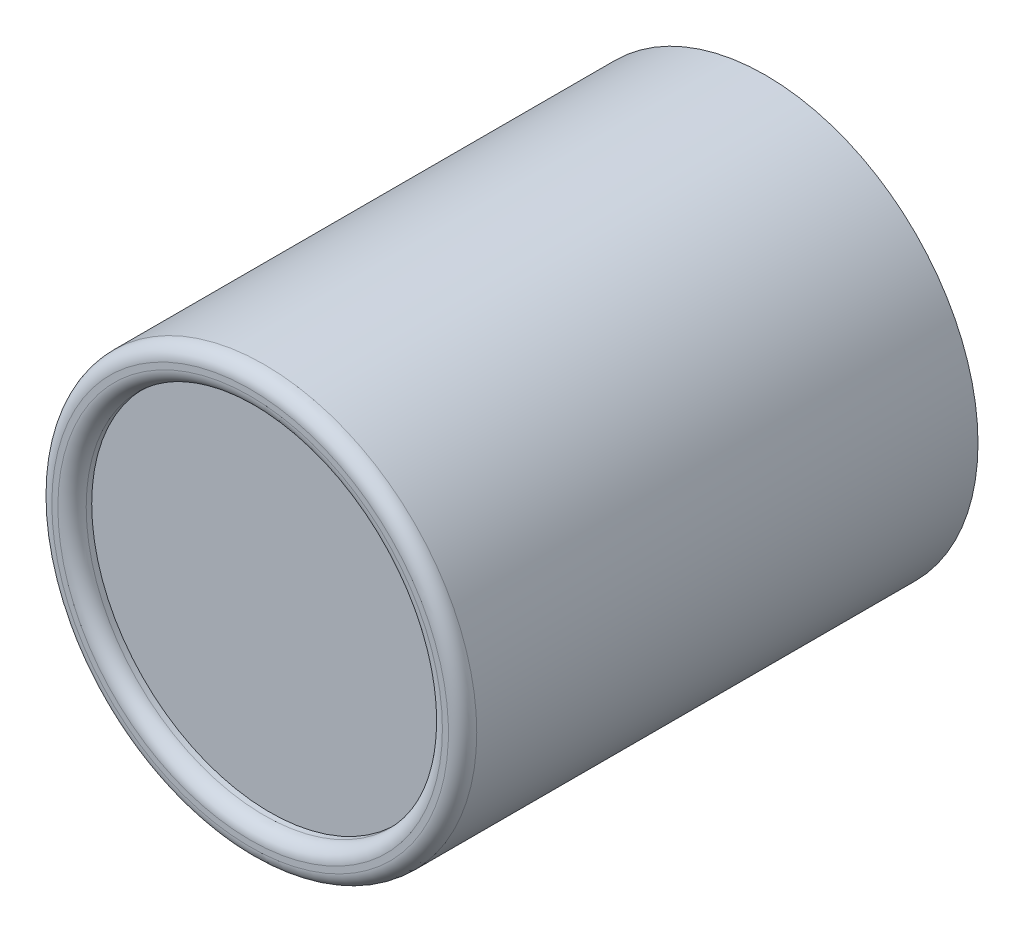
ISO-10303-21;
HEADER;
FILE_DESCRIPTION(('STEP AP214'),'2;1');
FILE_NAME('part.step','',(''),(''),'','','');
FILE_SCHEMA(('AUTOMOTIVE_DESIGN { 1 0 10303 214 1 1 1 1 }'));
ENDSEC;
DATA;
#1=APPLICATION_CONTEXT('core data for automotive mechanical design processes');
#2=APPLICATION_PROTOCOL_DEFINITION('international standard','automotive_design',2000,#1);
#3=PRODUCT_CONTEXT('',#1,'mechanical');
#4=PRODUCT('Part','Part','',(#3));
#5=PRODUCT_RELATED_PRODUCT_CATEGORY('part','',(#4));
#6=PRODUCT_DEFINITION_FORMATION('','',#4);
#7=PRODUCT_DEFINITION_CONTEXT('part definition',#1,'design');
#8=PRODUCT_DEFINITION('design','',#6,#7);
#9=PRODUCT_DEFINITION_SHAPE('','',#8);
#10=(LENGTH_UNIT() NAMED_UNIT(*) SI_UNIT(.MILLI.,.METRE.));
#11=(NAMED_UNIT(*) PLANE_ANGLE_UNIT() SI_UNIT($,.RADIAN.));
#12=(NAMED_UNIT(*) SI_UNIT($,.STERADIAN.) SOLID_ANGLE_UNIT());
#13=UNCERTAINTY_MEASURE_WITH_UNIT(LENGTH_MEASURE(1.E-05),#10,'distance_accuracy_value','');
#14=(GEOMETRIC_REPRESENTATION_CONTEXT(3) GLOBAL_UNCERTAINTY_ASSIGNED_CONTEXT((#13)) GLOBAL_UNIT_ASSIGNED_CONTEXT((#10,
#11,#12)) REPRESENTATION_CONTEXT('',''));
#15=CARTESIAN_POINT('',(0.,0.,0.));
#16=DIRECTION('',(0.,0.,1.));
#17=DIRECTION('',(1.,0.,0.));
#18=AXIS2_PLACEMENT_3D('',#15,#16,#17);
#19=CARTESIAN_POINT('',(0.,0.,0.));
#20=DIRECTION('',(0.,0.,-1.));
#21=DIRECTION('',(-1.,0.,0.));
#22=AXIS2_PLACEMENT_3D('',#19,#20,#21);
#23=CYLINDRICAL_SURFACE('',#22,0.75);
#24=CARTESIAN_POINT('',(0.,0.,0.769458866273396));
#25=DIRECTION('',(0.,0.,-1.));
#26=DIRECTION('',(-1.,0.,0.));
#27=AXIS2_PLACEMENT_3D('',#24,#25,#26);
#28=CIRCLE('',#27,0.75);
#29=CARTESIAN_POINT('',(-0.75,0.,0.769458866273396));
#30=VERTEX_POINT('',#29);
#31=EDGE_CURVE('E10',#30,#30,#28,.T.);
#32=ORIENTED_EDGE('',*,*,#31,.T.);
#33=EDGE_LOOP('',(#32));
#34=FACE_BOUND('',#33,.T.);
#35=CARTESIAN_POINT('',(0.,0.,-1.));
#36=DIRECTION('',(0.,0.,1.));
#37=DIRECTION('',(1.,0.,0.));
#38=AXIS2_PLACEMENT_3D('',#35,#36,#37);
#39=CIRCLE('',#38,0.75);
#40=CARTESIAN_POINT('',(0.75,0.,-1.));
#41=VERTEX_POINT('',#40);
#42=EDGE_CURVE('E56',#41,#41,#39,.T.);
#43=ORIENTED_EDGE('',*,*,#42,.T.);
#44=EDGE_LOOP('',(#43));
#45=FACE_BOUND('',#44,.T.);
#46=ADVANCED_FACE('F34',(#34,#45),#23,.T.);
#47=CARTESIAN_POINT('',(0.,0.,0.769458866273397));
#48=DIRECTION('',(0.,0.,-1.));
#49=DIRECTION('',(-1.,0.,0.));
#50=AXIS2_PLACEMENT_3D('',#47,#48,#49);
#51=TOROIDAL_SURFACE('',#50,0.7,0.05);
#52=CARTESIAN_POINT('',(0.,0.,0.819458866273397));
#53=DIRECTION('',(0.,0.,-1.));
#54=DIRECTION('',(-1.,0.,0.));
#55=AXIS2_PLACEMENT_3D('',#52,#53,#54);
#56=CIRCLE('',#55,0.7);
#57=CARTESIAN_POINT('',(-0.7,0.,0.819458866273397));
#58=VERTEX_POINT('',#57);
#59=EDGE_CURVE('E40',#58,#58,#56,.T.);
#60=ORIENTED_EDGE('',*,*,#59,.T.);
#61=EDGE_LOOP('',(#60));
#62=FACE_BOUND('',#61,.T.);
#63=ORIENTED_EDGE('',*,*,#31,.F.);
#64=EDGE_LOOP('',(#63));
#65=FACE_BOUND('',#64,.T.);
#66=ADVANCED_FACE('F72',(#62,#65),#51,.T.);
#67=CARTESIAN_POINT('',(0.,0.7,0.819458866273397));
#68=DIRECTION('',(0.,0.,1.));
#69=DIRECTION('',(1.,0.,0.));
#70=AXIS2_PLACEMENT_3D('',#67,#68,#69);
#71=PLANE('',#70);
#72=CARTESIAN_POINT('',(0.,0.,0.819458866273397));
#73=DIRECTION('',(0.,0.,-1.));
#74=DIRECTION('',(-1.,0.,0.));
#75=AXIS2_PLACEMENT_3D('',#72,#73,#74);
#76=CIRCLE('',#75,0.678768743353404);
#77=CARTESIAN_POINT('',(-0.678768743353404,0.,0.819458866273397));
#78=VERTEX_POINT('',#77);
#79=EDGE_CURVE('E44',#78,#78,#76,.T.);
#80=ORIENTED_EDGE('',*,*,#79,.T.);
#81=EDGE_LOOP('',(#80));
#82=FACE_BOUND('',#81,.T.);
#83=ORIENTED_EDGE('',*,*,#59,.F.);
#84=EDGE_LOOP('',(#83));
#85=FACE_BOUND('',#84,.T.);
#86=ADVANCED_FACE('F76',(#82,#85),#71,.T.);
#87=CARTESIAN_POINT('',(0.,0.,0.769458866273397));
#88=DIRECTION('',(0.,0.,-1.));
#89=DIRECTION('',(-1.,0.,0.));
#90=AXIS2_PLACEMENT_3D('',#87,#88,#89);
#91=TOROIDAL_SURFACE('',#90,0.678768743353404,0.05);
#92=CARTESIAN_POINT('',(0.,0.,0.769458866273396));
#93=DIRECTION('',(0.,0.,-1.));
#94=DIRECTION('',(-1.,0.,0.));
#95=AXIS2_PLACEMENT_3D('',#92,#93,#94);
#96=CIRCLE('',#95,0.628768743353404);
#97=CARTESIAN_POINT('',(-0.628768743353404,0.,0.769458866273396));
#98=VERTEX_POINT('',#97);
#99=EDGE_CURVE('E48',#98,#98,#96,.T.);
#100=ORIENTED_EDGE('',*,*,#99,.T.);
#101=EDGE_LOOP('',(#100));
#102=FACE_BOUND('',#101,.T.);
#103=ORIENTED_EDGE('',*,*,#79,.F.);
#104=EDGE_LOOP('',(#103));
#105=FACE_BOUND('',#104,.T.);
#106=ADVANCED_FACE('F80',(#102,#105),#91,.T.);
#107=CARTESIAN_POINT('',(0.,0.,0.));
#108=DIRECTION('',(0.,0.,-1.));
#109=DIRECTION('',(-1.,0.,0.));
#110=AXIS2_PLACEMENT_3D('',#107,#108,#109);
#111=CYLINDRICAL_SURFACE('',#110,0.628768743353404);
#112=CARTESIAN_POINT('',(0.,0.,0.75));
#113=DIRECTION('',(0.,0.,-1.));
#114=DIRECTION('',(-1.,0.,0.));
#115=AXIS2_PLACEMENT_3D('',#112,#113,#114);
#116=CIRCLE('',#115,0.628768743353404);
#117=CARTESIAN_POINT('',(-0.628768743353404,0.,0.75));
#118=VERTEX_POINT('',#117);
#119=EDGE_CURVE('E53',#118,#118,#116,.T.);
#120=ORIENTED_EDGE('',*,*,#119,.T.);
#121=EDGE_LOOP('',(#120));
#122=FACE_BOUND('',#121,.T.);
#123=ORIENTED_EDGE('',*,*,#99,.F.);
#124=EDGE_LOOP('',(#123));
#125=FACE_BOUND('',#124,.T.);
#126=ADVANCED_FACE('F68',(#122,#125),#111,.F.);
#127=CARTESIAN_POINT('',(0.,0.628768743353404,0.75));
#128=DIRECTION('',(0.,0.,1.));
#129=DIRECTION('',(1.,0.,0.));
#130=AXIS2_PLACEMENT_3D('',#127,#128,#129);
#131=PLANE('',#130);
#132=ORIENTED_EDGE('',*,*,#119,.F.);
#133=EDGE_LOOP('',(#132));
#134=FACE_BOUND('',#133,.T.);
#135=ADVANCED_FACE('F63',(#134),#131,.T.);
#136=CARTESIAN_POINT('',(0.,0.,-1.));
#137=DIRECTION('',(0.,0.,1.));
#138=DIRECTION('',(1.,0.,0.));
#139=AXIS2_PLACEMENT_3D('',#136,#137,#138);
#140=PLANE('',#139);
#141=ORIENTED_EDGE('',*,*,#42,.F.);
#142=EDGE_LOOP('',(#141));
#143=FACE_BOUND('',#142,.T.);
#144=ADVANCED_FACE('F61',(#143),#140,.F.);
#145=CLOSED_SHELL('',(#46,#66,#86,#106,#126,#135,#144));
#146=MANIFOLD_SOLID_BREP('B2',#145);
#147=ADVANCED_BREP_SHAPE_REPRESENTATION('',(#18,#146),#14);
#148=SHAPE_DEFINITION_REPRESENTATION(#9,#147);
ENDSEC;
END-ISO-10303-21;
